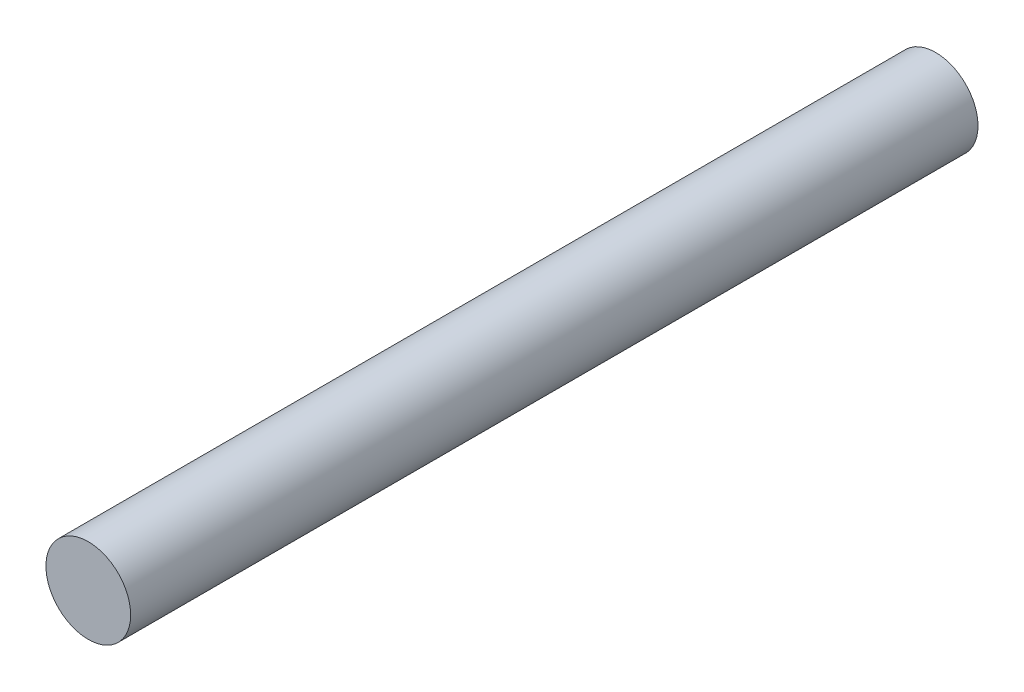
ISO-10303-21;
HEADER;
FILE_DESCRIPTION(('STEP AP214'),'2;1');
FILE_NAME('part.step','',(''),(''),'','','');
FILE_SCHEMA(('AUTOMOTIVE_DESIGN { 1 0 10303 214 1 1 1 1 }'));
ENDSEC;
DATA;
#1=APPLICATION_CONTEXT('core data for automotive mechanical design processes');
#2=APPLICATION_PROTOCOL_DEFINITION('international standard','automotive_design',2000,#1);
#3=PRODUCT_CONTEXT('',#1,'mechanical');
#4=PRODUCT('Part','Part','',(#3));
#5=PRODUCT_RELATED_PRODUCT_CATEGORY('part','',(#4));
#6=PRODUCT_DEFINITION_FORMATION('','',#4);
#7=PRODUCT_DEFINITION_CONTEXT('part definition',#1,'design');
#8=PRODUCT_DEFINITION('design','',#6,#7);
#9=PRODUCT_DEFINITION_SHAPE('','',#8);
#10=(LENGTH_UNIT() NAMED_UNIT(*) SI_UNIT(.MILLI.,.METRE.));
#11=(NAMED_UNIT(*) PLANE_ANGLE_UNIT() SI_UNIT($,.RADIAN.));
#12=(NAMED_UNIT(*) SI_UNIT($,.STERADIAN.) SOLID_ANGLE_UNIT());
#13=UNCERTAINTY_MEASURE_WITH_UNIT(LENGTH_MEASURE(1.E-05),#10,'distance_accuracy_value','');
#14=(GEOMETRIC_REPRESENTATION_CONTEXT(3) GLOBAL_UNCERTAINTY_ASSIGNED_CONTEXT((#13)) GLOBAL_UNIT_ASSIGNED_CONTEXT((#10,
#11,#12)) REPRESENTATION_CONTEXT('',''));
#15=CARTESIAN_POINT('',(0.,0.,0.));
#16=DIRECTION('',(0.,0.,1.));
#17=DIRECTION('',(1.,0.,0.));
#18=AXIS2_PLACEMENT_3D('',#15,#16,#17);
#19=CARTESIAN_POINT('',(0.,0.,15.));
#20=DIRECTION('',(0.,0.,-1.));
#21=DIRECTION('',(-1.,0.,0.));
#22=AXIS2_PLACEMENT_3D('',#19,#20,#21);
#23=CYLINDRICAL_SURFACE('',#22,1.5);
#24=CARTESIAN_POINT('',(0.,0.,15.));
#25=DIRECTION('',(0.,0.,1.));
#26=DIRECTION('',(1.,0.,0.));
#27=AXIS2_PLACEMENT_3D('',#24,#25,#26);
#28=CIRCLE('',#27,1.5);
#29=CARTESIAN_POINT('',(1.5,0.,15.));
#30=VERTEX_POINT('',#29);
#31=EDGE_CURVE('E12',#30,#30,#28,.T.);
#32=ORIENTED_EDGE('',*,*,#31,.F.);
#33=EDGE_LOOP('',(#32));
#34=FACE_BOUND('',#33,.T.);
#35=CARTESIAN_POINT('',(0.,0.,-15.));
#36=DIRECTION('',(0.,0.,1.));
#37=DIRECTION('',(1.,0.,0.));
#38=AXIS2_PLACEMENT_3D('',#35,#36,#37);
#39=CIRCLE('',#38,1.5);
#40=CARTESIAN_POINT('',(1.5,0.,-15.));
#41=VERTEX_POINT('',#40);
#42=EDGE_CURVE('E45',#41,#41,#39,.T.);
#43=ORIENTED_EDGE('',*,*,#42,.T.);
#44=EDGE_LOOP('',(#43));
#45=FACE_BOUND('',#44,.T.);
#46=ADVANCED_FACE('F42',(#34,#45),#23,.T.);
#47=CARTESIAN_POINT('',(0.,0.,15.));
#48=DIRECTION('',(0.,0.,1.));
#49=DIRECTION('',(1.,0.,0.));
#50=AXIS2_PLACEMENT_3D('',#47,#48,#49);
#51=PLANE('',#50);
#52=ORIENTED_EDGE('',*,*,#31,.T.);
#53=EDGE_LOOP('',(#52));
#54=FACE_BOUND('',#53,.T.);
#55=ADVANCED_FACE('F57',(#54),#51,.T.);
#56=CARTESIAN_POINT('',(0.,0.,-15.));
#57=DIRECTION('',(0.,0.,1.));
#58=DIRECTION('',(1.,0.,0.));
#59=AXIS2_PLACEMENT_3D('',#56,#57,#58);
#60=PLANE('',#59);
#61=ORIENTED_EDGE('',*,*,#42,.F.);
#62=EDGE_LOOP('',(#61));
#63=FACE_BOUND('',#62,.T.);
#64=ADVANCED_FACE('F55',(#63),#60,.F.);
#65=CLOSED_SHELL('',(#46,#55,#64));
#66=MANIFOLD_SOLID_BREP('B2',#65);
#67=ADVANCED_BREP_SHAPE_REPRESENTATION('',(#18,#66),#14);
#68=SHAPE_DEFINITION_REPRESENTATION(#9,#67);
ENDSEC;
END-ISO-10303-21;
